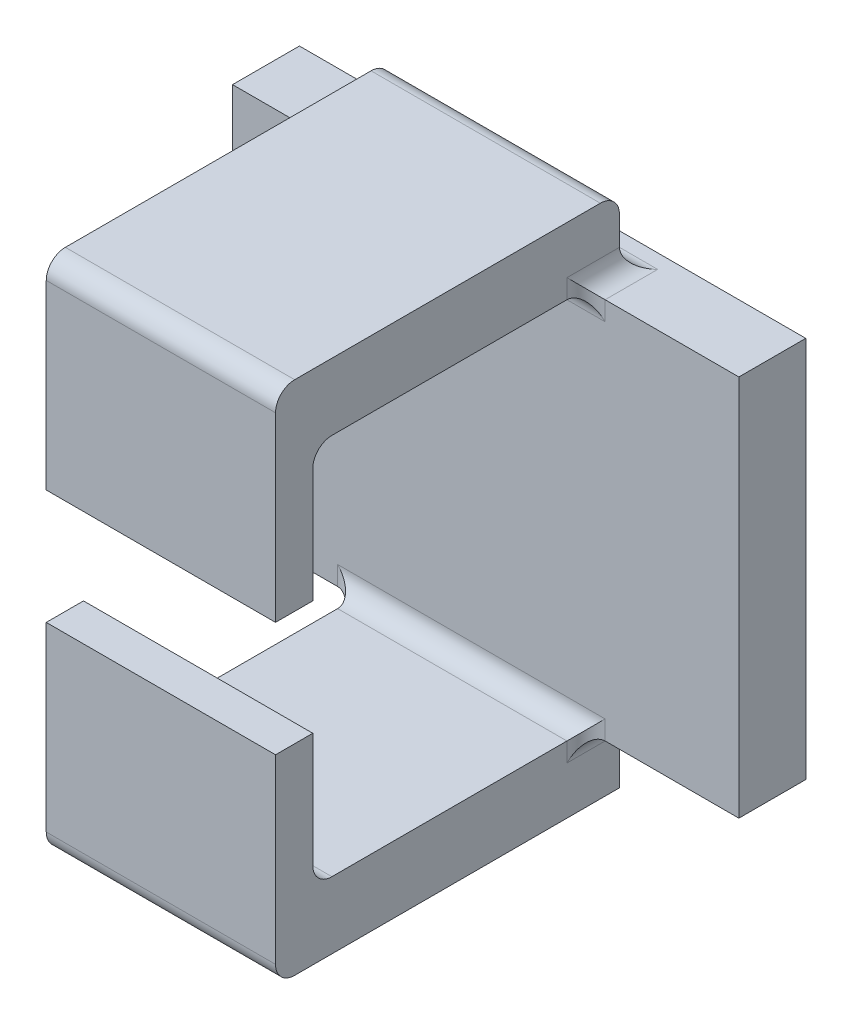
ISO-10303-21;
HEADER;
FILE_DESCRIPTION(('STEP AP214'),'2;1');
FILE_NAME('part.step','',(''),(''),'','','');
FILE_SCHEMA(('AUTOMOTIVE_DESIGN { 1 0 10303 214 1 1 1 1 }'));
ENDSEC;
DATA;
#1=APPLICATION_CONTEXT('core data for automotive mechanical design processes');
#2=APPLICATION_PROTOCOL_DEFINITION('international standard','automotive_design',2000,#1);
#3=PRODUCT_CONTEXT('',#1,'mechanical');
#4=PRODUCT('Part','Part','',(#3));
#5=PRODUCT_RELATED_PRODUCT_CATEGORY('part','',(#4));
#6=PRODUCT_DEFINITION_FORMATION('','',#4);
#7=PRODUCT_DEFINITION_CONTEXT('part definition',#1,'design');
#8=PRODUCT_DEFINITION('design','',#6,#7);
#9=PRODUCT_DEFINITION_SHAPE('','',#8);
#10=(LENGTH_UNIT() NAMED_UNIT(*) SI_UNIT(.MILLI.,.METRE.));
#11=(NAMED_UNIT(*) PLANE_ANGLE_UNIT() SI_UNIT($,.RADIAN.));
#12=(NAMED_UNIT(*) SI_UNIT($,.STERADIAN.) SOLID_ANGLE_UNIT());
#13=UNCERTAINTY_MEASURE_WITH_UNIT(LENGTH_MEASURE(1.E-05),#10,'distance_accuracy_value','');
#14=(GEOMETRIC_REPRESENTATION_CONTEXT(3) GLOBAL_UNCERTAINTY_ASSIGNED_CONTEXT((#13)) GLOBAL_UNIT_ASSIGNED_CONTEXT((#10,
#11,#12)) REPRESENTATION_CONTEXT('',''));
#15=CARTESIAN_POINT('',(0.,0.,0.));
#16=DIRECTION('',(0.,0.,1.));
#17=DIRECTION('',(1.,0.,0.));
#18=AXIS2_PLACEMENT_3D('',#15,#16,#17);
#19=CARTESIAN_POINT('',(0.,10.,0.));
#20=DIRECTION('',(0.,-1.,0.));
#21=DIRECTION('',(0.,0.,-1.));
#22=AXIS2_PLACEMENT_3D('',#19,#20,#21);
#23=PLANE('',#22);
#24=DIRECTION('',(0.,0.,-1.));
#25=VECTOR('',#24,1.);
#26=CARTESIAN_POINT('',(5.25,10.,1.75));
#27=LINE('',#26,#25);
#28=CARTESIAN_POINT('',(5.25000000000001,10.,16.8));
#29=VERTEX_POINT('',#28);
#30=CARTESIAN_POINT('',(5.25,10.,4.5));
#31=VERTEX_POINT('',#30);
#32=EDGE_CURVE('E303',#29,#31,#27,.T.);
#33=ORIENTED_EDGE('',*,*,#32,.F.);
#34=DIRECTION('',(1.,0.,0.));
#35=VECTOR('',#34,1.);
#36=CARTESIAN_POINT('',(0.,10.,16.8));
#37=LINE('',#36,#35);
#38=CARTESIAN_POINT('',(-6.75,10.,16.8));
#39=VERTEX_POINT('',#38);
#40=EDGE_CURVE('E453',#29,#39,#37,.F.);
#41=ORIENTED_EDGE('',*,*,#40,.T.);
#42=DIRECTION('',(0.,0.,1.));
#43=VECTOR('',#42,1.);
#44=CARTESIAN_POINT('',(-6.75,10.,1.75));
#45=LINE('',#44,#43);
#46=CARTESIAN_POINT('',(-6.75,10.,4.5));
#47=VERTEX_POINT('',#46);
#48=EDGE_CURVE('E308',#47,#39,#45,.T.);
#49=ORIENTED_EDGE('',*,*,#48,.F.);
#50=DIRECTION('',(-1.,0.,0.));
#51=VECTOR('',#50,1.);
#52=CARTESIAN_POINT('',(5.25000000000001,10.,4.5));
#53=LINE('',#52,#51);
#54=EDGE_CURVE('E361',#47,#31,#53,.F.);
#55=ORIENTED_EDGE('',*,*,#54,.T.);
#56=EDGE_LOOP('',(#33,#41,#49,#55));
#57=FACE_BOUND('',#56,.T.);
#58=ADVANCED_FACE('F33',(#57),#23,.T.);
#59=CARTESIAN_POINT('',(0.,-10.,0.));
#60=DIRECTION('',(0.,-1.,0.));
#61=DIRECTION('',(0.,0.,-1.));
#62=AXIS2_PLACEMENT_3D('',#59,#60,#61);
#63=PLANE('',#62);
#64=DIRECTION('',(0.,0.,-1.));
#65=VECTOR('',#64,1.);
#66=CARTESIAN_POINT('',(-6.75,-10.,1.75));
#67=LINE('',#66,#65);
#68=CARTESIAN_POINT('',(-6.75,-10.,16.8));
#69=VERTEX_POINT('',#68);
#70=CARTESIAN_POINT('',(-6.75,-10.,4.5));
#71=VERTEX_POINT('',#70);
#72=EDGE_CURVE('E287',#69,#71,#67,.T.);
#73=ORIENTED_EDGE('',*,*,#72,.F.);
#74=DIRECTION('',(-1.,0.,0.));
#75=VECTOR('',#74,1.);
#76=CARTESIAN_POINT('',(5.25,-10.,16.8));
#77=LINE('',#76,#75);
#78=CARTESIAN_POINT('',(5.25,-10.,16.8));
#79=VERTEX_POINT('',#78);
#80=EDGE_CURVE('E54',#69,#79,#77,.F.);
#81=ORIENTED_EDGE('',*,*,#80,.T.);
#82=DIRECTION('',(0.,0.,1.));
#83=VECTOR('',#82,1.);
#84=CARTESIAN_POINT('',(5.25,-10.,1.75));
#85=LINE('',#84,#83);
#86=CARTESIAN_POINT('',(5.25,-10.,4.5));
#87=VERTEX_POINT('',#86);
#88=EDGE_CURVE('E282',#87,#79,#85,.T.);
#89=ORIENTED_EDGE('',*,*,#88,.F.);
#90=DIRECTION('',(1.,0.,0.));
#91=VECTOR('',#90,1.);
#92=CARTESIAN_POINT('',(0.,-10.,4.5));
#93=LINE('',#92,#91);
#94=EDGE_CURVE('E371',#87,#71,#93,.F.);
#95=ORIENTED_EDGE('',*,*,#94,.T.);
#96=EDGE_LOOP('',(#73,#81,#89,#95));
#97=FACE_BOUND('',#96,.T.);
#98=ADVANCED_FACE('F516',(#97),#63,.F.);
#99=CARTESIAN_POINT('',(-13.25,-10.,3.5));
#100=DIRECTION('',(0.,1.,0.));
#101=DIRECTION('',(0.,0.,1.));
#102=AXIS2_PLACEMENT_3D('',#99,#100,#101);
#103=PLANE('',#102);
#104=DIRECTION('',(1.,0.,0.));
#105=VECTOR('',#104,1.);
#106=CARTESIAN_POINT('',(-13.25,-10.,3.5));
#107=LINE('',#106,#105);
#108=CARTESIAN_POINT('',(6.25,-10.,3.5));
#109=VERTEX_POINT('',#108);
#110=CARTESIAN_POINT('',(13.25,-10.,3.5));
#111=VERTEX_POINT('',#110);
#112=EDGE_CURVE('E331',#109,#111,#107,.T.);
#113=ORIENTED_EDGE('',*,*,#112,.F.);
#114=DIRECTION('',(0.,0.,1.));
#115=VECTOR('',#114,1.);
#116=CARTESIAN_POINT('',(6.25,-10.,0.75));
#117=LINE('',#116,#115);
#118=CARTESIAN_POINT('',(6.25,-10.,0.75));
#119=VERTEX_POINT('',#118);
#120=EDGE_CURVE('E435',#109,#119,#117,.F.);
#121=ORIENTED_EDGE('',*,*,#120,.T.);
#122=DIRECTION('',(1.,0.,0.));
#123=VECTOR('',#122,1.);
#124=CARTESIAN_POINT('',(-6.75,-10.,0.75));
#125=LINE('',#124,#123);
#126=CARTESIAN_POINT('',(-7.75,-10.,0.75));
#127=VERTEX_POINT('',#126);
#128=EDGE_CURVE('E367',#119,#127,#125,.F.);
#129=ORIENTED_EDGE('',*,*,#128,.T.);
#130=DIRECTION('',(0.,0.,-1.));
#131=VECTOR('',#130,1.);
#132=CARTESIAN_POINT('',(-7.75,-10.,3.5));
#133=LINE('',#132,#131);
#134=CARTESIAN_POINT('',(-7.75,-10.,3.5));
#135=VERTEX_POINT('',#134);
#136=EDGE_CURVE('E416',#127,#135,#133,.F.);
#137=ORIENTED_EDGE('',*,*,#136,.T.);
#138=CARTESIAN_POINT('',(-13.25,-10.,3.5));
#139=VERTEX_POINT('',#138);
#140=EDGE_CURVE('E332',#139,#135,#107,.T.);
#141=ORIENTED_EDGE('',*,*,#140,.F.);
#142=DIRECTION('',(0.,0.,-1.));
#143=VECTOR('',#142,1.);
#144=CARTESIAN_POINT('',(-13.25,-10.,3.5));
#145=LINE('',#144,#143);
#146=CARTESIAN_POINT('',(-13.25,-10.,0.));
#147=VERTEX_POINT('',#146);
#148=EDGE_CURVE('E345',#139,#147,#145,.T.);
#149=ORIENTED_EDGE('',*,*,#148,.T.);
#150=DIRECTION('',(1.,0.,0.));
#151=VECTOR('',#150,1.);
#152=CARTESIAN_POINT('',(-13.25,-10.,0.));
#153=LINE('',#152,#151);
#154=CARTESIAN_POINT('',(13.25,-10.,0.));
#155=VERTEX_POINT('',#154);
#156=EDGE_CURVE('E325',#147,#155,#153,.T.);
#157=ORIENTED_EDGE('',*,*,#156,.T.);
#158=DIRECTION('',(0.,0.,-1.));
#159=VECTOR('',#158,1.);
#160=CARTESIAN_POINT('',(13.25,-10.,3.5));
#161=LINE('',#160,#159);
#162=EDGE_CURVE('E335',#111,#155,#161,.T.);
#163=ORIENTED_EDGE('',*,*,#162,.F.);
#164=EDGE_LOOP('',(#113,#121,#129,#137,#141,#149,#157,#163));
#165=FACE_BOUND('',#164,.T.);
#166=ADVANCED_FACE('F522',(#165),#103,.F.);
#167=CARTESIAN_POINT('',(-13.25,10.,3.5));
#168=DIRECTION('',(0.,-1.,0.));
#169=DIRECTION('',(0.,0.,-1.));
#170=AXIS2_PLACEMENT_3D('',#167,#168,#169);
#171=PLANE('',#170);
#172=DIRECTION('',(-1.,0.,0.));
#173=VECTOR('',#172,1.);
#174=CARTESIAN_POINT('',(-13.25,10.,3.5));
#175=LINE('',#174,#173);
#176=CARTESIAN_POINT('',(-7.75,10.,3.5));
#177=VERTEX_POINT('',#176);
#178=CARTESIAN_POINT('',(-13.25,10.,3.5));
#179=VERTEX_POINT('',#178);
#180=EDGE_CURVE('E324',#177,#179,#175,.T.);
#181=ORIENTED_EDGE('',*,*,#180,.F.);
#182=DIRECTION('',(0.,0.,1.));
#183=VECTOR('',#182,1.);
#184=CARTESIAN_POINT('',(-7.75,10.,0.750000000000002));
#185=LINE('',#184,#183);
#186=CARTESIAN_POINT('',(-7.75,10.,0.750000000000002));
#187=VERTEX_POINT('',#186);
#188=EDGE_CURVE('E385',#177,#187,#185,.F.);
#189=ORIENTED_EDGE('',*,*,#188,.T.);
#190=DIRECTION('',(-1.,0.,0.));
#191=VECTOR('',#190,1.);
#192=CARTESIAN_POINT('',(5.25,10.,0.75));
#193=LINE('',#192,#191);
#194=CARTESIAN_POINT('',(6.25,10.,0.75));
#195=VERTEX_POINT('',#194);
#196=EDGE_CURVE('E357',#187,#195,#193,.F.);
#197=ORIENTED_EDGE('',*,*,#196,.T.);
#198=DIRECTION('',(0.,0.,-1.));
#199=VECTOR('',#198,1.);
#200=CARTESIAN_POINT('',(6.25,10.,3.5));
#201=LINE('',#200,#199);
#202=CARTESIAN_POINT('',(6.25,10.,3.5));
#203=VERTEX_POINT('',#202);
#204=EDGE_CURVE('E377',#195,#203,#201,.F.);
#205=ORIENTED_EDGE('',*,*,#204,.T.);
#206=CARTESIAN_POINT('',(13.25,10.,3.5));
#207=VERTEX_POINT('',#206);
#208=EDGE_CURVE('E326',#207,#203,#175,.T.);
#209=ORIENTED_EDGE('',*,*,#208,.F.);
#210=DIRECTION('',(0.,0.,-1.));
#211=VECTOR('',#210,1.);
#212=CARTESIAN_POINT('',(13.25,10.,3.5));
#213=LINE('',#212,#211);
#214=CARTESIAN_POINT('',(13.25,10.,0.));
#215=VERTEX_POINT('',#214);
#216=EDGE_CURVE('E351',#207,#215,#213,.T.);
#217=ORIENTED_EDGE('',*,*,#216,.T.);
#218=DIRECTION('',(-1.,0.,0.));
#219=VECTOR('',#218,1.);
#220=CARTESIAN_POINT('',(-13.25,10.,0.));
#221=LINE('',#220,#219);
#222=CARTESIAN_POINT('',(-13.25,10.,0.));
#223=VERTEX_POINT('',#222);
#224=EDGE_CURVE('E338',#215,#223,#221,.T.);
#225=ORIENTED_EDGE('',*,*,#224,.T.);
#226=DIRECTION('',(0.,0.,-1.));
#227=VECTOR('',#226,1.);
#228=CARTESIAN_POINT('',(-13.25,10.,3.5));
#229=LINE('',#228,#227);
#230=EDGE_CURVE('E348',#179,#223,#229,.T.);
#231=ORIENTED_EDGE('',*,*,#230,.F.);
#232=EDGE_LOOP('',(#181,#189,#197,#205,#209,#217,#225,#231));
#233=FACE_BOUND('',#232,.T.);
#234=ADVANCED_FACE('F554',(#233),#171,.F.);
#235=CARTESIAN_POINT('',(13.25,10.,3.5));
#236=DIRECTION('',(-1.,0.,0.));
#237=DIRECTION('',(0.,0.,1.));
#238=AXIS2_PLACEMENT_3D('',#235,#236,#237);
#239=PLANE('',#238);
#240=DIRECTION('',(0.,1.,0.));
#241=VECTOR('',#240,1.);
#242=CARTESIAN_POINT('',(13.25,10.,0.));
#243=LINE('',#242,#241);
#244=EDGE_CURVE('E320',#155,#215,#243,.T.);
#245=ORIENTED_EDGE('',*,*,#244,.T.);
#246=ORIENTED_EDGE('',*,*,#216,.F.);
#247=DIRECTION('',(0.,1.,0.));
#248=VECTOR('',#247,1.);
#249=CARTESIAN_POINT('',(13.25,10.,3.5));
#250=LINE('',#249,#248);
#251=EDGE_CURVE('E321',#111,#207,#250,.T.);
#252=ORIENTED_EDGE('',*,*,#251,.F.);
#253=ORIENTED_EDGE('',*,*,#162,.T.);
#254=EDGE_LOOP('',(#245,#246,#252,#253));
#255=FACE_BOUND('',#254,.T.);
#256=ADVANCED_FACE('F558',(#255),#239,.F.);
#257=CARTESIAN_POINT('',(-13.25,10.,3.5));
#258=DIRECTION('',(1.,0.,0.));
#259=DIRECTION('',(0.,1.,0.));
#260=AXIS2_PLACEMENT_3D('',#257,#258,#259);
#261=PLANE('',#260);
#262=DIRECTION('',(0.,-1.,0.));
#263=VECTOR('',#262,1.);
#264=CARTESIAN_POINT('',(-13.25,10.,0.));
#265=LINE('',#264,#263);
#266=EDGE_CURVE('E340',#223,#147,#265,.T.);
#267=ORIENTED_EDGE('',*,*,#266,.T.);
#268=ORIENTED_EDGE('',*,*,#148,.F.);
#269=DIRECTION('',(0.,-1.,0.));
#270=VECTOR('',#269,1.);
#271=CARTESIAN_POINT('',(-13.25,10.,3.5));
#272=LINE('',#271,#270);
#273=EDGE_CURVE('E329',#179,#139,#272,.T.);
#274=ORIENTED_EDGE('',*,*,#273,.F.);
#275=ORIENTED_EDGE('',*,*,#230,.T.);
#276=EDGE_LOOP('',(#267,#268,#274,#275));
#277=FACE_BOUND('',#276,.T.);
#278=ADVANCED_FACE('F547',(#277),#261,.F.);
#279=CARTESIAN_POINT('',(0.,0.,3.5));
#280=DIRECTION('',(0.,0.,1.));
#281=DIRECTION('',(1.,0.,0.));
#282=AXIS2_PLACEMENT_3D('',#279,#280,#281);
#283=PLANE('',#282);
#284=DIRECTION('',(1.,0.,0.));
#285=VECTOR('',#284,1.);
#286=CARTESIAN_POINT('',(0.,-9.,3.5));
#287=LINE('',#286,#285);
#288=CARTESIAN_POINT('',(-7.75,-9.,3.5));
#289=VERTEX_POINT('',#288);
#290=CARTESIAN_POINT('',(6.25,-9.,3.5));
#291=VERTEX_POINT('',#290);
#292=EDGE_CURVE('E369',#289,#291,#287,.T.);
#293=ORIENTED_EDGE('',*,*,#292,.T.);
#294=DIRECTION('',(0.,-1.,0.));
#295=VECTOR('',#294,1.);
#296=CARTESIAN_POINT('',(6.25,0.,3.5));
#297=LINE('',#296,#295);
#298=EDGE_CURVE('E440',#291,#109,#297,.T.);
#299=ORIENTED_EDGE('',*,*,#298,.T.);
#300=ORIENTED_EDGE('',*,*,#112,.T.);
#301=ORIENTED_EDGE('',*,*,#251,.T.);
#302=ORIENTED_EDGE('',*,*,#208,.T.);
#303=DIRECTION('',(0.,-1.,0.));
#304=VECTOR('',#303,1.);
#305=CARTESIAN_POINT('',(6.25,0.,3.5));
#306=LINE('',#305,#304);
#307=CARTESIAN_POINT('',(6.25,9.,3.5));
#308=VERTEX_POINT('',#307);
#309=EDGE_CURVE('E391',#203,#308,#306,.T.);
#310=ORIENTED_EDGE('',*,*,#309,.T.);
#311=DIRECTION('',(-1.,0.,0.));
#312=VECTOR('',#311,1.);
#313=CARTESIAN_POINT('',(-6.75,9.,3.5));
#314=LINE('',#313,#312);
#315=CARTESIAN_POINT('',(-7.75,9.,3.5));
#316=VERTEX_POINT('',#315);
#317=EDGE_CURVE('E359',#308,#316,#314,.T.);
#318=ORIENTED_EDGE('',*,*,#317,.T.);
#319=DIRECTION('',(0.,1.,0.));
#320=VECTOR('',#319,1.);
#321=CARTESIAN_POINT('',(-7.75,0.,3.5));
#322=LINE('',#321,#320);
#323=EDGE_CURVE('E402',#316,#177,#322,.T.);
#324=ORIENTED_EDGE('',*,*,#323,.T.);
#325=ORIENTED_EDGE('',*,*,#180,.T.);
#326=ORIENTED_EDGE('',*,*,#273,.T.);
#327=ORIENTED_EDGE('',*,*,#140,.T.);
#328=DIRECTION('',(0.,1.,0.));
#329=VECTOR('',#328,1.);
#330=CARTESIAN_POINT('',(-7.75,0.,3.5));
#331=LINE('',#330,#329);
#332=EDGE_CURVE('E422',#135,#289,#331,.T.);
#333=ORIENTED_EDGE('',*,*,#332,.T.);
#334=EDGE_LOOP('',(#293,#299,#300,#301,#302,#310,#318,#324,#325,#326,#327,#333));
#335=FACE_BOUND('',#334,.T.);
#336=ADVANCED_FACE('F544',(#335),#283,.T.);
#337=CARTESIAN_POINT('',(0.,0.,0.));
#338=DIRECTION('',(0.,0.,1.));
#339=DIRECTION('',(1.,0.,0.));
#340=AXIS2_PLACEMENT_3D('',#337,#338,#339);
#341=PLANE('',#340);
#342=ORIENTED_EDGE('',*,*,#244,.F.);
#343=ORIENTED_EDGE('',*,*,#156,.F.);
#344=ORIENTED_EDGE('',*,*,#266,.F.);
#345=ORIENTED_EDGE('',*,*,#224,.F.);
#346=EDGE_LOOP('',(#342,#343,#344,#345));
#347=FACE_BOUND('',#346,.T.);
#348=ADVANCED_FACE('F542',(#347),#341,.F.);
#349=CARTESIAN_POINT('',(5.25,13.5,1.75));
#350=DIRECTION('',(-1.,0.,0.));
#351=DIRECTION('',(0.,0.,1.));
#352=AXIS2_PLACEMENT_3D('',#349,#350,#351);
#353=PLANE('',#352);
#354=DIRECTION('',(0.,-1.,0.));
#355=VECTOR('',#354,1.);
#356=CARTESIAN_POINT('',(5.25,13.5,1.75));
#357=LINE('',#356,#355);
#358=CARTESIAN_POINT('',(5.25,12.5,1.75));
#359=VERTEX_POINT('',#358);
#360=CARTESIAN_POINT('',(5.25,11.,1.75));
#361=VERTEX_POINT('',#360);
#362=EDGE_CURVE('E318',#359,#361,#357,.T.);
#363=ORIENTED_EDGE('',*,*,#362,.F.);
#364=CARTESIAN_POINT('',(5.25,12.5,2.75));
#365=DIRECTION('',(-1.,0.,0.));
#366=DIRECTION('',(0.,0.,1.));
#367=AXIS2_PLACEMENT_3D('',#364,#365,#366);
#368=CIRCLE('',#367,1.);
#369=CARTESIAN_POINT('',(5.25,13.5,2.75));
#370=VERTEX_POINT('',#369);
#371=EDGE_CURVE('E475',#359,#370,#368,.F.);
#372=ORIENTED_EDGE('',*,*,#371,.T.);
#373=DIRECTION('',(0.,0.,-1.));
#374=VECTOR('',#373,1.);
#375=CARTESIAN_POINT('',(5.25,13.5,1.75));
#376=LINE('',#375,#374);
#377=CARTESIAN_POINT('',(5.25000000000001,13.5,18.75));
#378=VERTEX_POINT('',#377);
#379=EDGE_CURVE('E304',#378,#370,#376,.T.);
#380=ORIENTED_EDGE('',*,*,#379,.F.);
#381=CARTESIAN_POINT('',(5.25000000000001,12.5,18.75));
#382=DIRECTION('',(-1.,0.,0.));
#383=DIRECTION('',(0.,0.,1.));
#384=AXIS2_PLACEMENT_3D('',#381,#382,#383);
#385=CIRCLE('',#384,1.);
#386=CARTESIAN_POINT('',(5.25000000000001,12.5,19.75));
#387=VERTEX_POINT('',#386);
#388=EDGE_CURVE('E461',#378,#387,#385,.F.);
#389=ORIENTED_EDGE('',*,*,#388,.T.);
#390=DIRECTION('',(0.,-1.,0.));
#391=VECTOR('',#390,1.);
#392=CARTESIAN_POINT('',(5.25000000000001,13.5,19.75));
#393=LINE('',#392,#391);
#394=CARTESIAN_POINT('',(5.25000000000001,3.,19.75));
#395=VERTEX_POINT('',#394);
#396=EDGE_CURVE('E310',#387,#395,#393,.T.);
#397=ORIENTED_EDGE('',*,*,#396,.T.);
#398=DIRECTION('',(0.,0.,1.));
#399=VECTOR('',#398,1.);
#400=CARTESIAN_POINT('',(5.25000000000001,3.,19.75));
#401=LINE('',#400,#399);
#402=CARTESIAN_POINT('',(5.25000000000001,3.,17.8));
#403=VERTEX_POINT('',#402);
#404=EDGE_CURVE('E247',#403,#395,#401,.T.);
#405=ORIENTED_EDGE('',*,*,#404,.F.);
#406=DIRECTION('',(0.,1.,0.));
#407=VECTOR('',#406,1.);
#408=CARTESIAN_POINT('',(5.25000000000001,3.,17.8));
#409=LINE('',#408,#407);
#410=CARTESIAN_POINT('',(5.25000000000001,9.,17.8));
#411=VERTEX_POINT('',#410);
#412=EDGE_CURVE('E243',#403,#411,#409,.T.);
#413=ORIENTED_EDGE('',*,*,#412,.T.);
#414=CARTESIAN_POINT('',(5.25,9.,16.8));
#415=DIRECTION('',(-1.,0.,0.));
#416=DIRECTION('',(0.,0.,1.));
#417=AXIS2_PLACEMENT_3D('',#414,#415,#416);
#418=CIRCLE('',#417,1.);
#419=EDGE_CURVE('E455',#411,#29,#418,.T.);
#420=ORIENTED_EDGE('',*,*,#419,.T.);
#421=ORIENTED_EDGE('',*,*,#32,.T.);
#422=DIRECTION('',(0.,-1.,0.));
#423=VECTOR('',#422,1.);
#424=CARTESIAN_POINT('',(5.25,13.5,4.5));
#425=LINE('',#424,#423);
#426=CARTESIAN_POINT('',(5.25,11.,4.5));
#427=VERTEX_POINT('',#426);
#428=EDGE_CURVE('E394',#31,#427,#425,.F.);
#429=ORIENTED_EDGE('',*,*,#428,.T.);
#430=DIRECTION('',(0.,0.,-1.));
#431=VECTOR('',#430,1.);
#432=CARTESIAN_POINT('',(5.25,11.,0.75));
#433=LINE('',#432,#431);
#434=EDGE_CURVE('E374',#427,#361,#433,.T.);
#435=ORIENTED_EDGE('',*,*,#434,.T.);
#436=EDGE_LOOP('',(#363,#372,#380,#389,#397,#405,#413,#420,#421,#429,#435));
#437=FACE_BOUND('',#436,.T.);
#438=ADVANCED_FACE('F538',(#437),#353,.F.);
#439=CARTESIAN_POINT('',(5.25,13.5,1.75));
#440=DIRECTION('',(0.,0.,1.));
#441=DIRECTION('',(1.,0.,0.));
#442=AXIS2_PLACEMENT_3D('',#439,#440,#441);
#443=PLANE('',#442);
#444=DIRECTION('',(0.,-1.,0.));
#445=VECTOR('',#444,1.);
#446=CARTESIAN_POINT('',(-6.75,13.5,1.75));
#447=LINE('',#446,#445);
#448=CARTESIAN_POINT('',(-6.75,12.5,1.75));
#449=VERTEX_POINT('',#448);
#450=CARTESIAN_POINT('',(-6.75,11.,1.75));
#451=VERTEX_POINT('',#450);
#452=EDGE_CURVE('E316',#449,#451,#447,.T.);
#453=ORIENTED_EDGE('',*,*,#452,.F.);
#454=DIRECTION('',(-1.,0.,0.));
#455=VECTOR('',#454,1.);
#456=CARTESIAN_POINT('',(5.25,12.5,1.75));
#457=LINE('',#456,#455);
#458=EDGE_CURVE('E473',#449,#359,#457,.F.);
#459=ORIENTED_EDGE('',*,*,#458,.T.);
#460=ORIENTED_EDGE('',*,*,#362,.T.);
#461=DIRECTION('',(-1.,0.,0.));
#462=VECTOR('',#461,1.);
#463=CARTESIAN_POINT('',(-6.75,11.,1.75));
#464=LINE('',#463,#462);
#465=EDGE_CURVE('E354',#361,#451,#464,.T.);
#466=ORIENTED_EDGE('',*,*,#465,.T.);
#467=EDGE_LOOP('',(#453,#459,#460,#466));
#468=FACE_BOUND('',#467,.T.);
#469=ADVANCED_FACE('F535',(#468),#443,.F.);
#470=CARTESIAN_POINT('',(-6.75,13.5,1.75));
#471=DIRECTION('',(1.,0.,0.));
#472=DIRECTION('',(0.,0.,-1.));
#473=AXIS2_PLACEMENT_3D('',#470,#471,#472);
#474=PLANE('',#473);
#475=DIRECTION('',(0.,0.,1.));
#476=VECTOR('',#475,1.);
#477=CARTESIAN_POINT('',(-6.75,13.5,1.75));
#478=LINE('',#477,#476);
#479=CARTESIAN_POINT('',(-6.75,13.5,2.75));
#480=VERTEX_POINT('',#479);
#481=CARTESIAN_POINT('',(-6.75,13.5,18.75));
#482=VERTEX_POINT('',#481);
#483=EDGE_CURVE('E307',#480,#482,#478,.T.);
#484=ORIENTED_EDGE('',*,*,#483,.F.);
#485=CARTESIAN_POINT('',(-6.75,12.5,2.75));
#486=DIRECTION('',(1.,0.,0.));
#487=DIRECTION('',(0.,0.,-1.));
#488=AXIS2_PLACEMENT_3D('',#485,#486,#487);
#489=CIRCLE('',#488,1.);
#490=EDGE_CURVE('E471',#480,#449,#489,.F.);
#491=ORIENTED_EDGE('',*,*,#490,.T.);
#492=ORIENTED_EDGE('',*,*,#452,.T.);
#493=DIRECTION('',(0.,0.,1.));
#494=VECTOR('',#493,1.);
#495=CARTESIAN_POINT('',(-6.75,11.,3.5));
#496=LINE('',#495,#494);
#497=CARTESIAN_POINT('',(-6.75,11.,4.5));
#498=VERTEX_POINT('',#497);
#499=EDGE_CURVE('E383',#451,#498,#496,.T.);
#500=ORIENTED_EDGE('',*,*,#499,.T.);
#501=DIRECTION('',(0.,1.,0.));
#502=VECTOR('',#501,1.);
#503=CARTESIAN_POINT('',(-6.75,13.5,4.5));
#504=LINE('',#503,#502);
#505=EDGE_CURVE('E405',#498,#47,#504,.F.);
#506=ORIENTED_EDGE('',*,*,#505,.T.);
#507=ORIENTED_EDGE('',*,*,#48,.T.);
#508=CARTESIAN_POINT('',(-6.75,9.,16.8));
#509=DIRECTION('',(1.,0.,0.));
#510=DIRECTION('',(0.,0.,-1.));
#511=AXIS2_PLACEMENT_3D('',#508,#509,#510);
#512=CIRCLE('',#511,1.);
#513=CARTESIAN_POINT('',(-6.75,9.,17.8));
#514=VERTEX_POINT('',#513);
#515=EDGE_CURVE('E262',#39,#514,#512,.T.);
#516=ORIENTED_EDGE('',*,*,#515,.T.);
#517=DIRECTION('',(0.,1.,0.));
#518=VECTOR('',#517,1.);
#519=CARTESIAN_POINT('',(-6.75,3.,17.8));
#520=LINE('',#519,#518);
#521=CARTESIAN_POINT('',(-6.75,3.,17.8));
#522=VERTEX_POINT('',#521);
#523=EDGE_CURVE('E240',#522,#514,#520,.T.);
#524=ORIENTED_EDGE('',*,*,#523,.F.);
#525=DIRECTION('',(0.,0.,-1.));
#526=VECTOR('',#525,1.);
#527=CARTESIAN_POINT('',(-6.75,3.,19.75));
#528=LINE('',#527,#526);
#529=CARTESIAN_POINT('',(-6.75,3.,19.75));
#530=VERTEX_POINT('',#529);
#531=EDGE_CURVE('E248',#530,#522,#528,.T.);
#532=ORIENTED_EDGE('',*,*,#531,.F.);
#533=DIRECTION('',(0.,-1.,0.));
#534=VECTOR('',#533,1.);
#535=CARTESIAN_POINT('',(-6.75,13.5,19.75));
#536=LINE('',#535,#534);
#537=CARTESIAN_POINT('',(-6.75,12.5,19.75));
#538=VERTEX_POINT('',#537);
#539=EDGE_CURVE('E314',#538,#530,#536,.T.);
#540=ORIENTED_EDGE('',*,*,#539,.F.);
#541=CARTESIAN_POINT('',(-6.75,12.5,18.75));
#542=DIRECTION('',(1.,0.,0.));
#543=DIRECTION('',(0.,0.,-1.));
#544=AXIS2_PLACEMENT_3D('',#541,#542,#543);
#545=CIRCLE('',#544,1.);
#546=EDGE_CURVE('E465',#538,#482,#545,.F.);
#547=ORIENTED_EDGE('',*,*,#546,.T.);
#548=EDGE_LOOP('',(#484,#491,#492,#500,#506,#507,#516,#524,#532,#540,#547));
#549=FACE_BOUND('',#548,.T.);
#550=ADVANCED_FACE('F259',(#549),#474,.F.);
#551=CARTESIAN_POINT('',(5.25000000000001,13.5,19.75));
#552=DIRECTION('',(0.,0.,-1.));
#553=DIRECTION('',(-1.,0.,0.));
#554=AXIS2_PLACEMENT_3D('',#551,#552,#553);
#555=PLANE('',#554);
#556=ORIENTED_EDGE('',*,*,#396,.F.);
#557=DIRECTION('',(1.,0.,0.));
#558=VECTOR('',#557,1.);
#559=CARTESIAN_POINT('',(5.25000000000001,12.5,19.75));
#560=LINE('',#559,#558);
#561=EDGE_CURVE('E463',#387,#538,#560,.F.);
#562=ORIENTED_EDGE('',*,*,#561,.T.);
#563=ORIENTED_EDGE('',*,*,#539,.T.);
#564=DIRECTION('',(-1.,0.,0.));
#565=VECTOR('',#564,1.);
#566=CARTESIAN_POINT('',(-6.75,3.,19.75));
#567=LINE('',#566,#565);
#568=EDGE_CURVE('E254',#395,#530,#567,.T.);
#569=ORIENTED_EDGE('',*,*,#568,.F.);
#570=EDGE_LOOP('',(#556,#562,#563,#569));
#571=FACE_BOUND('',#570,.T.);
#572=ADVANCED_FACE('F529',(#571),#555,.F.);
#573=CARTESIAN_POINT('',(0.,13.5,0.));
#574=DIRECTION('',(0.,-1.,0.));
#575=DIRECTION('',(0.,0.,-1.));
#576=AXIS2_PLACEMENT_3D('',#573,#574,#575);
#577=PLANE('',#576);
#578=ORIENTED_EDGE('',*,*,#379,.T.);
#579=DIRECTION('',(-1.,0.,0.));
#580=VECTOR('',#579,1.);
#581=CARTESIAN_POINT('',(0.,13.5,2.75));
#582=LINE('',#581,#580);
#583=EDGE_CURVE('E468',#370,#480,#582,.T.);
#584=ORIENTED_EDGE('',*,*,#583,.T.);
#585=ORIENTED_EDGE('',*,*,#483,.T.);
#586=DIRECTION('',(1.,0.,0.));
#587=VECTOR('',#586,1.);
#588=CARTESIAN_POINT('',(0.,13.5,18.75));
#589=LINE('',#588,#587);
#590=EDGE_CURVE('E458',#482,#378,#589,.T.);
#591=ORIENTED_EDGE('',*,*,#590,.T.);
#592=EDGE_LOOP('',(#578,#584,#585,#591));
#593=FACE_BOUND('',#592,.T.);
#594=ADVANCED_FACE('F527',(#593),#577,.F.);
#595=CARTESIAN_POINT('',(5.25,11.,0.75));
#596=DIRECTION('',(1.,0.,0.));
#597=DIRECTION('',(0.,0.,-1.));
#598=AXIS2_PLACEMENT_3D('',#595,#596,#597);
#599=CYLINDRICAL_SURFACE('',#598,1.);
#600=ORIENTED_EDGE('',*,*,#465,.F.);
#601=CARTESIAN_POINT('',(6.25,11.,0.75));
#602=DIRECTION('',(0.707106781186548,0.,0.707106781186547));
#603=DIRECTION('',(0.707106781186547,0.,-0.707106781186548));
#604=AXIS2_PLACEMENT_3D('',#601,#602,#603);
#605=ELLIPSE('',#604,1.41421356237309,1.);
#606=EDGE_CURVE('E380',#361,#195,#605,.T.);
#607=ORIENTED_EDGE('',*,*,#606,.T.);
#608=ORIENTED_EDGE('',*,*,#196,.F.);
#609=CARTESIAN_POINT('',(-7.75,11.,0.750000000000002));
#610=DIRECTION('',(0.707106781186547,0.,-0.707106781186548));
#611=DIRECTION('',(0.707106781186548,0.,0.707106781186547));
#612=AXIS2_PLACEMENT_3D('',#609,#610,#611);
#613=ELLIPSE('',#612,1.41421356237309,1.);
#614=EDGE_CURVE('E388',#187,#451,#613,.F.);
#615=ORIENTED_EDGE('',*,*,#614,.T.);
#616=EDGE_LOOP('',(#600,#607,#608,#615));
#617=FACE_BOUND('',#616,.T.);
#618=ADVANCED_FACE('F566',(#617),#599,.F.);
#619=CARTESIAN_POINT('',(0.,9.,4.5));
#620=DIRECTION('',(1.,0.,0.));
#621=DIRECTION('',(0.,0.,-1.));
#622=AXIS2_PLACEMENT_3D('',#619,#620,#621);
#623=CYLINDRICAL_SURFACE('',#622,1.);
#624=ORIENTED_EDGE('',*,*,#317,.F.);
#625=CARTESIAN_POINT('',(6.25,9.,4.5));
#626=DIRECTION('',(0.707106781186547,0.707106781186547,0.));
#627=DIRECTION('',(0.707106781186547,-0.707106781186547,0.));
#628=AXIS2_PLACEMENT_3D('',#625,#626,#627);
#629=ELLIPSE('',#628,1.41421356237309,1.);
#630=EDGE_CURVE('E397',#308,#31,#629,.T.);
#631=ORIENTED_EDGE('',*,*,#630,.T.);
#632=ORIENTED_EDGE('',*,*,#54,.F.);
#633=CARTESIAN_POINT('',(-7.75,9.,4.5));
#634=DIRECTION('',(0.707106781186547,-0.707106781186547,0.));
#635=DIRECTION('',(0.707106781186547,0.707106781186547,0.));
#636=AXIS2_PLACEMENT_3D('',#633,#634,#635);
#637=ELLIPSE('',#636,1.41421356237309,1.);
#638=EDGE_CURVE('E410',#47,#316,#637,.F.);
#639=ORIENTED_EDGE('',*,*,#638,.T.);
#640=EDGE_LOOP('',(#624,#631,#632,#639));
#641=FACE_BOUND('',#640,.T.);
#642=ADVANCED_FACE('F569',(#641),#623,.F.);
#643=CARTESIAN_POINT('',(5.25,-13.5,1.75));
#644=DIRECTION('',(-1.,0.,0.));
#645=DIRECTION('',(0.,0.,1.));
#646=AXIS2_PLACEMENT_3D('',#643,#644,#645);
#647=PLANE('',#646);
#648=DIRECTION('',(0.,1.,0.));
#649=VECTOR('',#648,1.);
#650=CARTESIAN_POINT('',(5.25,-13.5,19.75));
#651=LINE('',#650,#649);
#652=CARTESIAN_POINT('',(5.25,-12.5,19.75));
#653=VERTEX_POINT('',#652);
#654=CARTESIAN_POINT('',(5.25,-3.,19.75));
#655=VERTEX_POINT('',#654);
#656=EDGE_CURVE('E301',#653,#655,#651,.T.);
#657=ORIENTED_EDGE('',*,*,#656,.F.);
#658=CARTESIAN_POINT('',(5.25,-12.5,18.75));
#659=DIRECTION('',(-1.,0.,0.));
#660=DIRECTION('',(0.,0.,1.));
#661=AXIS2_PLACEMENT_3D('',#658,#659,#660);
#662=CIRCLE('',#661,1.);
#663=CARTESIAN_POINT('',(5.25,-13.5,18.75));
#664=VERTEX_POINT('',#663);
#665=EDGE_CURVE('E484',#653,#664,#662,.F.);
#666=ORIENTED_EDGE('',*,*,#665,.T.);
#667=DIRECTION('',(0.,0.,1.));
#668=VECTOR('',#667,1.);
#669=CARTESIAN_POINT('',(5.25,-13.5,1.75));
#670=LINE('',#669,#668);
#671=CARTESIAN_POINT('',(5.25,-13.5,1.75));
#672=VERTEX_POINT('',#671);
#673=EDGE_CURVE('E283',#672,#664,#670,.T.);
#674=ORIENTED_EDGE('',*,*,#673,.F.);
#675=DIRECTION('',(0.,1.,0.));
#676=VECTOR('',#675,1.);
#677=CARTESIAN_POINT('',(5.25,-13.5,1.75));
#678=LINE('',#677,#676);
#679=CARTESIAN_POINT('',(5.25,-11.,1.75));
#680=VERTEX_POINT('',#679);
#681=EDGE_CURVE('E291',#672,#680,#678,.T.);
#682=ORIENTED_EDGE('',*,*,#681,.T.);
#683=DIRECTION('',(0.,0.,1.));
#684=VECTOR('',#683,1.);
#685=CARTESIAN_POINT('',(5.25,-11.,3.5));
#686=LINE('',#685,#684);
#687=CARTESIAN_POINT('',(5.25,-11.,4.5));
#688=VERTEX_POINT('',#687);
#689=EDGE_CURVE('E433',#680,#688,#686,.T.);
#690=ORIENTED_EDGE('',*,*,#689,.T.);
#691=DIRECTION('',(0.,-1.,0.));
#692=VECTOR('',#691,1.);
#693=CARTESIAN_POINT('',(5.25,-13.5,4.5));
#694=LINE('',#693,#692);
#695=EDGE_CURVE('E443',#688,#87,#694,.F.);
#696=ORIENTED_EDGE('',*,*,#695,.T.);
#697=ORIENTED_EDGE('',*,*,#88,.T.);
#698=CARTESIAN_POINT('',(5.25,-9.,16.8));
#699=DIRECTION('',(-1.,0.,0.));
#700=DIRECTION('',(0.,0.,1.));
#701=AXIS2_PLACEMENT_3D('',#698,#699,#700);
#702=CIRCLE('',#701,1.);
#703=CARTESIAN_POINT('',(5.25,-9.,17.8));
#704=VERTEX_POINT('',#703);
#705=EDGE_CURVE('E11',#79,#704,#702,.T.);
#706=ORIENTED_EDGE('',*,*,#705,.T.);
#707=DIRECTION('',(0.,-1.,0.));
#708=VECTOR('',#707,1.);
#709=CARTESIAN_POINT('',(5.25,-3.,17.8));
#710=LINE('',#709,#708);
#711=CARTESIAN_POINT('',(5.25,-3.,17.8));
#712=VERTEX_POINT('',#711);
#713=EDGE_CURVE('E279',#712,#704,#710,.T.);
#714=ORIENTED_EDGE('',*,*,#713,.F.);
#715=DIRECTION('',(0.,0.,-1.));
#716=VECTOR('',#715,1.);
#717=CARTESIAN_POINT('',(5.25,-3.,19.75));
#718=LINE('',#717,#716);
#719=EDGE_CURVE('E273',#655,#712,#718,.T.);
#720=ORIENTED_EDGE('',*,*,#719,.F.);
#721=EDGE_LOOP('',(#657,#666,#674,#682,#690,#696,#697,#706,#714,#720));
#722=FACE_BOUND('',#721,.T.);
#723=ADVANCED_FACE('F507',(#722),#647,.F.);
#724=CARTESIAN_POINT('',(5.25,-13.5,19.75));
#725=DIRECTION('',(0.,0.,-1.));
#726=DIRECTION('',(-1.,0.,0.));
#727=AXIS2_PLACEMENT_3D('',#724,#725,#726);
#728=PLANE('',#727);
#729=DIRECTION('',(0.,1.,0.));
#730=VECTOR('',#729,1.);
#731=CARTESIAN_POINT('',(-6.75,-13.5,19.75));
#732=LINE('',#731,#730);
#733=CARTESIAN_POINT('',(-6.75,-12.5,19.75));
#734=VERTEX_POINT('',#733);
#735=CARTESIAN_POINT('',(-6.75,-3.,19.75));
#736=VERTEX_POINT('',#735);
#737=EDGE_CURVE('E299',#734,#736,#732,.T.);
#738=ORIENTED_EDGE('',*,*,#737,.F.);
#739=DIRECTION('',(-1.,0.,0.));
#740=VECTOR('',#739,1.);
#741=CARTESIAN_POINT('',(5.25,-12.5,19.75));
#742=LINE('',#741,#740);
#743=EDGE_CURVE('E482',#734,#653,#742,.F.);
#744=ORIENTED_EDGE('',*,*,#743,.T.);
#745=ORIENTED_EDGE('',*,*,#656,.T.);
#746=DIRECTION('',(1.,0.,0.));
#747=VECTOR('',#746,1.);
#748=CARTESIAN_POINT('',(-6.75,-3.,19.75));
#749=LINE('',#748,#747);
#750=EDGE_CURVE('E266',#736,#655,#749,.T.);
#751=ORIENTED_EDGE('',*,*,#750,.F.);
#752=EDGE_LOOP('',(#738,#744,#745,#751));
#753=FACE_BOUND('',#752,.T.);
#754=ADVANCED_FACE('F691',(#753),#728,.F.);
#755=CARTESIAN_POINT('',(-6.75,-13.5,1.75));
#756=DIRECTION('',(1.,0.,0.));
#757=DIRECTION('',(0.,0.,-1.));
#758=AXIS2_PLACEMENT_3D('',#755,#756,#757);
#759=PLANE('',#758);
#760=DIRECTION('',(0.,0.,-1.));
#761=VECTOR('',#760,1.);
#762=CARTESIAN_POINT('',(-6.75,-13.5,1.75));
#763=LINE('',#762,#761);
#764=CARTESIAN_POINT('',(-6.75,-13.5,18.75));
#765=VERTEX_POINT('',#764);
#766=CARTESIAN_POINT('',(-6.75,-13.5,1.75));
#767=VERTEX_POINT('',#766);
#768=EDGE_CURVE('E286',#765,#767,#763,.T.);
#769=ORIENTED_EDGE('',*,*,#768,.F.);
#770=CARTESIAN_POINT('',(-6.75,-12.5,18.75));
#771=DIRECTION('',(1.,0.,0.));
#772=DIRECTION('',(0.,0.,-1.));
#773=AXIS2_PLACEMENT_3D('',#770,#771,#772);
#774=CIRCLE('',#773,1.);
#775=EDGE_CURVE('E480',#765,#734,#774,.F.);
#776=ORIENTED_EDGE('',*,*,#775,.T.);
#777=ORIENTED_EDGE('',*,*,#737,.T.);
#778=DIRECTION('',(0.,0.,1.));
#779=VECTOR('',#778,1.);
#780=CARTESIAN_POINT('',(-6.75,-3.,19.75));
#781=LINE('',#780,#779);
#782=CARTESIAN_POINT('',(-6.75,-3.,17.8));
#783=VERTEX_POINT('',#782);
#784=EDGE_CURVE('E263',#783,#736,#781,.T.);
#785=ORIENTED_EDGE('',*,*,#784,.F.);
#786=DIRECTION('',(0.,-1.,0.));
#787=VECTOR('',#786,1.);
#788=CARTESIAN_POINT('',(-6.75,-3.,17.8));
#789=LINE('',#788,#787);
#790=CARTESIAN_POINT('',(-6.75,-9.,17.8));
#791=VERTEX_POINT('',#790);
#792=EDGE_CURVE('E277',#783,#791,#789,.T.);
#793=ORIENTED_EDGE('',*,*,#792,.T.);
#794=CARTESIAN_POINT('',(-6.75,-9.,16.8));
#795=DIRECTION('',(1.,0.,0.));
#796=DIRECTION('',(0.,0.,-1.));
#797=AXIS2_PLACEMENT_3D('',#794,#795,#796);
#798=CIRCLE('',#797,1.);
#799=EDGE_CURVE('E41',#791,#69,#798,.T.);
#800=ORIENTED_EDGE('',*,*,#799,.T.);
#801=ORIENTED_EDGE('',*,*,#72,.T.);
#802=DIRECTION('',(0.,1.,0.));
#803=VECTOR('',#802,1.);
#804=CARTESIAN_POINT('',(-6.75,-13.5,4.5));
#805=LINE('',#804,#803);
#806=CARTESIAN_POINT('',(-6.75,-11.,4.5));
#807=VERTEX_POINT('',#806);
#808=EDGE_CURVE('E425',#71,#807,#805,.F.);
#809=ORIENTED_EDGE('',*,*,#808,.T.);
#810=DIRECTION('',(0.,0.,-1.));
#811=VECTOR('',#810,1.);
#812=CARTESIAN_POINT('',(-6.75,-11.,0.75));
#813=LINE('',#812,#811);
#814=CARTESIAN_POINT('',(-6.75,-11.,1.75));
#815=VERTEX_POINT('',#814);
#816=EDGE_CURVE('E413',#807,#815,#813,.T.);
#817=ORIENTED_EDGE('',*,*,#816,.T.);
#818=DIRECTION('',(0.,1.,0.));
#819=VECTOR('',#818,1.);
#820=CARTESIAN_POINT('',(-6.75,-13.5,1.75));
#821=LINE('',#820,#819);
#822=EDGE_CURVE('E296',#767,#815,#821,.T.);
#823=ORIENTED_EDGE('',*,*,#822,.F.);
#824=EDGE_LOOP('',(#769,#776,#777,#785,#793,#800,#801,#809,#817,#823));
#825=FACE_BOUND('',#824,.T.);
#826=ADVANCED_FACE('F499',(#825),#759,.F.);
#827=CARTESIAN_POINT('',(5.25,-13.5,1.75));
#828=DIRECTION('',(0.,0.,1.));
#829=DIRECTION('',(1.,0.,0.));
#830=AXIS2_PLACEMENT_3D('',#827,#828,#829);
#831=PLANE('',#830);
#832=ORIENTED_EDGE('',*,*,#822,.T.);
#833=DIRECTION('',(1.,0.,0.));
#834=VECTOR('',#833,1.);
#835=CARTESIAN_POINT('',(5.25,-11.,1.75));
#836=LINE('',#835,#834);
#837=EDGE_CURVE('E364',#815,#680,#836,.T.);
#838=ORIENTED_EDGE('',*,*,#837,.T.);
#839=ORIENTED_EDGE('',*,*,#681,.F.);
#840=DIRECTION('',(1.,0.,0.));
#841=VECTOR('',#840,1.);
#842=CARTESIAN_POINT('',(5.25,-13.5,1.75));
#843=LINE('',#842,#841);
#844=EDGE_CURVE('E289',#767,#672,#843,.T.);
#845=ORIENTED_EDGE('',*,*,#844,.F.);
#846=EDGE_LOOP('',(#832,#838,#839,#845));
#847=FACE_BOUND('',#846,.T.);
#848=ADVANCED_FACE('F682',(#847),#831,.F.);
#849=CARTESIAN_POINT('',(0.,-13.5,0.));
#850=DIRECTION('',(0.,-1.,0.));
#851=DIRECTION('',(0.,0.,-1.));
#852=AXIS2_PLACEMENT_3D('',#849,#850,#851);
#853=PLANE('',#852);
#854=ORIENTED_EDGE('',*,*,#673,.T.);
#855=DIRECTION('',(-1.,0.,0.));
#856=VECTOR('',#855,1.);
#857=CARTESIAN_POINT('',(-6.75,-13.5,18.75));
#858=LINE('',#857,#856);
#859=EDGE_CURVE('E477',#664,#765,#858,.T.);
#860=ORIENTED_EDGE('',*,*,#859,.T.);
#861=ORIENTED_EDGE('',*,*,#768,.T.);
#862=ORIENTED_EDGE('',*,*,#844,.T.);
#863=EDGE_LOOP('',(#854,#860,#861,#862));
#864=FACE_BOUND('',#863,.T.);
#865=ADVANCED_FACE('F578',(#864),#853,.T.);
#866=CARTESIAN_POINT('',(5.25,-11.,0.75));
#867=DIRECTION('',(-1.,0.,0.));
#868=DIRECTION('',(0.,0.,1.));
#869=AXIS2_PLACEMENT_3D('',#866,#867,#868);
#870=CYLINDRICAL_SURFACE('',#869,1.);
#871=ORIENTED_EDGE('',*,*,#837,.F.);
#872=CARTESIAN_POINT('',(-7.75,-11.,0.75));
#873=DIRECTION('',(-0.707106781186547,0.,0.707106781186547));
#874=DIRECTION('',(-0.707106781186547,0.,-0.707106781186547));
#875=AXIS2_PLACEMENT_3D('',#872,#873,#874);
#876=ELLIPSE('',#875,1.41421356237309,1.);
#877=EDGE_CURVE('E419',#815,#127,#876,.T.);
#878=ORIENTED_EDGE('',*,*,#877,.T.);
#879=ORIENTED_EDGE('',*,*,#128,.F.);
#880=CARTESIAN_POINT('',(6.25,-11.,0.75));
#881=DIRECTION('',(-0.707106781186547,0.,-0.707106781186548));
#882=DIRECTION('',(-0.707106781186548,0.,0.707106781186547));
#883=AXIS2_PLACEMENT_3D('',#880,#881,#882);
#884=ELLIPSE('',#883,1.4142135623731,1.);
#885=EDGE_CURVE('E438',#119,#680,#884,.F.);
#886=ORIENTED_EDGE('',*,*,#885,.T.);
#887=EDGE_LOOP('',(#871,#878,#879,#886));
#888=FACE_BOUND('',#887,.T.);
#889=ADVANCED_FACE('F574',(#888),#870,.F.);
#890=CARTESIAN_POINT('',(0.,-9.,4.5));
#891=DIRECTION('',(1.,0.,0.));
#892=DIRECTION('',(0.,0.,-1.));
#893=AXIS2_PLACEMENT_3D('',#890,#891,#892);
#894=CYLINDRICAL_SURFACE('',#893,1.);
#895=ORIENTED_EDGE('',*,*,#292,.F.);
#896=CARTESIAN_POINT('',(-7.75,-9.,4.5));
#897=DIRECTION('',(0.707106781186547,0.707106781186547,0.));
#898=DIRECTION('',(0.707106781186547,-0.707106781186547,0.));
#899=AXIS2_PLACEMENT_3D('',#896,#897,#898);
#900=ELLIPSE('',#899,1.41421356237309,1.);
#901=EDGE_CURVE('E428',#289,#71,#900,.F.);
#902=ORIENTED_EDGE('',*,*,#901,.T.);
#903=ORIENTED_EDGE('',*,*,#94,.F.);
#904=CARTESIAN_POINT('',(6.25,-9.,4.5));
#905=DIRECTION('',(0.707106781186547,-0.707106781186547,0.));
#906=DIRECTION('',(0.707106781186547,0.707106781186547,0.));
#907=AXIS2_PLACEMENT_3D('',#904,#905,#906);
#908=ELLIPSE('',#907,1.41421356237309,1.);
#909=EDGE_CURVE('E448',#87,#291,#908,.T.);
#910=ORIENTED_EDGE('',*,*,#909,.T.);
#911=EDGE_LOOP('',(#895,#902,#903,#910));
#912=FACE_BOUND('',#911,.T.);
#913=ADVANCED_FACE('F577',(#912),#894,.F.);
#914=CARTESIAN_POINT('',(6.25,11.,1.75));
#915=DIRECTION('',(0.,0.,1.));
#916=DIRECTION('',(1.,0.,0.));
#917=AXIS2_PLACEMENT_3D('',#914,#915,#916);
#918=CYLINDRICAL_SURFACE('',#917,1.);
#919=ORIENTED_EDGE('',*,*,#434,.F.);
#920=CARTESIAN_POINT('',(6.25,11.,4.5));
#921=DIRECTION('',(0.,-0.707106781186547,0.707106781186547));
#922=DIRECTION('',(0.,0.707106781186547,0.707106781186547));
#923=AXIS2_PLACEMENT_3D('',#920,#921,#922);
#924=ELLIPSE('',#923,1.41421356237309,1.);
#925=EDGE_CURVE('E400',#427,#203,#924,.T.);
#926=ORIENTED_EDGE('',*,*,#925,.T.);
#927=ORIENTED_EDGE('',*,*,#204,.F.);
#928=ORIENTED_EDGE('',*,*,#606,.F.);
#929=EDGE_LOOP('',(#919,#926,#927,#928));
#930=FACE_BOUND('',#929,.T.);
#931=ADVANCED_FACE('F582',(#930),#918,.F.);
#932=CARTESIAN_POINT('',(-7.75,11.,1.75));
#933=DIRECTION('',(0.,0.,-1.));
#934=DIRECTION('',(-1.,0.,0.));
#935=AXIS2_PLACEMENT_3D('',#932,#933,#934);
#936=CYLINDRICAL_SURFACE('',#935,1.);
#937=ORIENTED_EDGE('',*,*,#614,.F.);
#938=ORIENTED_EDGE('',*,*,#188,.F.);
#939=CARTESIAN_POINT('',(-7.75,11.,4.5));
#940=DIRECTION('',(0.,0.707106781186547,-0.707106781186547));
#941=DIRECTION('',(0.,-0.707106781186547,-0.707106781186547));
#942=AXIS2_PLACEMENT_3D('',#939,#940,#941);
#943=ELLIPSE('',#942,1.41421356237309,1.);
#944=EDGE_CURVE('E407',#177,#498,#943,.F.);
#945=ORIENTED_EDGE('',*,*,#944,.T.);
#946=ORIENTED_EDGE('',*,*,#499,.F.);
#947=EDGE_LOOP('',(#937,#938,#945,#946));
#948=FACE_BOUND('',#947,.T.);
#949=ADVANCED_FACE('F586',(#948),#936,.F.);
#950=CARTESIAN_POINT('',(6.25,0.,4.5));
#951=DIRECTION('',(0.,-1.,0.));
#952=DIRECTION('',(0.,0.,-1.));
#953=AXIS2_PLACEMENT_3D('',#950,#951,#952);
#954=CYLINDRICAL_SURFACE('',#953,1.);
#955=ORIENTED_EDGE('',*,*,#925,.F.);
#956=ORIENTED_EDGE('',*,*,#428,.F.);
#957=ORIENTED_EDGE('',*,*,#630,.F.);
#958=ORIENTED_EDGE('',*,*,#309,.F.);
#959=EDGE_LOOP('',(#955,#956,#957,#958));
#960=FACE_BOUND('',#959,.T.);
#961=ADVANCED_FACE('F590',(#960),#954,.F.);
#962=CARTESIAN_POINT('',(-7.75,0.,4.5));
#963=DIRECTION('',(0.,1.,0.));
#964=DIRECTION('',(0.,0.,1.));
#965=AXIS2_PLACEMENT_3D('',#962,#963,#964);
#966=CYLINDRICAL_SURFACE('',#965,1.);
#967=ORIENTED_EDGE('',*,*,#638,.F.);
#968=ORIENTED_EDGE('',*,*,#505,.F.);
#969=ORIENTED_EDGE('',*,*,#944,.F.);
#970=ORIENTED_EDGE('',*,*,#323,.F.);
#971=EDGE_LOOP('',(#967,#968,#969,#970));
#972=FACE_BOUND('',#971,.T.);
#973=ADVANCED_FACE('F594',(#972),#966,.F.);
#974=CARTESIAN_POINT('',(-7.75,-11.,1.75));
#975=DIRECTION('',(0.,0.,1.));
#976=DIRECTION('',(1.,0.,0.));
#977=AXIS2_PLACEMENT_3D('',#974,#975,#976);
#978=CYLINDRICAL_SURFACE('',#977,1.);
#979=ORIENTED_EDGE('',*,*,#816,.F.);
#980=CARTESIAN_POINT('',(-7.75,-11.,4.5));
#981=DIRECTION('',(0.,0.707106781186547,0.707106781186547));
#982=DIRECTION('',(0.,-0.707106781186547,0.707106781186547));
#983=AXIS2_PLACEMENT_3D('',#980,#981,#982);
#984=ELLIPSE('',#983,1.41421356237309,1.);
#985=EDGE_CURVE('E431',#807,#135,#984,.T.);
#986=ORIENTED_EDGE('',*,*,#985,.T.);
#987=ORIENTED_EDGE('',*,*,#136,.F.);
#988=ORIENTED_EDGE('',*,*,#877,.F.);
#989=EDGE_LOOP('',(#979,#986,#987,#988));
#990=FACE_BOUND('',#989,.T.);
#991=ADVANCED_FACE('F598',(#990),#978,.F.);
#992=CARTESIAN_POINT('',(-7.75,0.,4.5));
#993=DIRECTION('',(0.,1.,0.));
#994=DIRECTION('',(0.,0.,1.));
#995=AXIS2_PLACEMENT_3D('',#992,#993,#994);
#996=CYLINDRICAL_SURFACE('',#995,1.);
#997=ORIENTED_EDGE('',*,*,#985,.F.);
#998=ORIENTED_EDGE('',*,*,#808,.F.);
#999=ORIENTED_EDGE('',*,*,#901,.F.);
#1000=ORIENTED_EDGE('',*,*,#332,.F.);
#1001=EDGE_LOOP('',(#997,#998,#999,#1000));
#1002=FACE_BOUND('',#1001,.T.);
#1003=ADVANCED_FACE('F602',(#1002),#996,.F.);
#1004=CARTESIAN_POINT('',(6.25,-11.,1.75));
#1005=DIRECTION('',(0.,0.,-1.));
#1006=DIRECTION('',(-1.,0.,0.));
#1007=AXIS2_PLACEMENT_3D('',#1004,#1005,#1006);
#1008=CYLINDRICAL_SURFACE('',#1007,1.);
#1009=ORIENTED_EDGE('',*,*,#885,.F.);
#1010=ORIENTED_EDGE('',*,*,#120,.F.);
#1011=CARTESIAN_POINT('',(6.25,-11.,4.5));
#1012=DIRECTION('',(0.,-0.707106781186547,-0.707106781186547));
#1013=DIRECTION('',(0.,0.707106781186547,-0.707106781186547));
#1014=AXIS2_PLACEMENT_3D('',#1011,#1012,#1013);
#1015=ELLIPSE('',#1014,1.41421356237309,1.);
#1016=EDGE_CURVE('E445',#109,#688,#1015,.F.);
#1017=ORIENTED_EDGE('',*,*,#1016,.T.);
#1018=ORIENTED_EDGE('',*,*,#689,.F.);
#1019=EDGE_LOOP('',(#1009,#1010,#1017,#1018));
#1020=FACE_BOUND('',#1019,.T.);
#1021=ADVANCED_FACE('F606',(#1020),#1008,.F.);
#1022=CARTESIAN_POINT('',(6.25,0.,4.5));
#1023=DIRECTION('',(0.,-1.,0.));
#1024=DIRECTION('',(0.,0.,-1.));
#1025=AXIS2_PLACEMENT_3D('',#1022,#1023,#1024);
#1026=CYLINDRICAL_SURFACE('',#1025,1.);
#1027=ORIENTED_EDGE('',*,*,#909,.F.);
#1028=ORIENTED_EDGE('',*,*,#695,.F.);
#1029=ORIENTED_EDGE('',*,*,#1016,.F.);
#1030=ORIENTED_EDGE('',*,*,#298,.F.);
#1031=EDGE_LOOP('',(#1027,#1028,#1029,#1030));
#1032=FACE_BOUND('',#1031,.T.);
#1033=ADVANCED_FACE('F610',(#1032),#1026,.F.);
#1034=CARTESIAN_POINT('',(-6.75,-3.,17.8));
#1035=DIRECTION('',(0.,0.,1.));
#1036=DIRECTION('',(1.,0.,0.));
#1037=AXIS2_PLACEMENT_3D('',#1034,#1035,#1036);
#1038=PLANE('',#1037);
#1039=ORIENTED_EDGE('',*,*,#713,.T.);
#1040=DIRECTION('',(-1.,0.,0.));
#1041=VECTOR('',#1040,1.);
#1042=CARTESIAN_POINT('',(-6.75,-9.,17.8));
#1043=LINE('',#1042,#1041);
#1044=EDGE_CURVE('E486',#704,#791,#1043,.T.);
#1045=ORIENTED_EDGE('',*,*,#1044,.T.);
#1046=ORIENTED_EDGE('',*,*,#792,.F.);
#1047=DIRECTION('',(-1.,0.,0.));
#1048=VECTOR('',#1047,1.);
#1049=CARTESIAN_POINT('',(-6.75,-3.,17.8));
#1050=LINE('',#1049,#1048);
#1051=EDGE_CURVE('E275',#712,#783,#1050,.T.);
#1052=ORIENTED_EDGE('',*,*,#1051,.F.);
#1053=EDGE_LOOP('',(#1039,#1045,#1046,#1052));
#1054=FACE_BOUND('',#1053,.T.);
#1055=ADVANCED_FACE('F492',(#1054),#1038,.F.);
#1056=CARTESIAN_POINT('',(0.,-3.,0.));
#1057=DIRECTION('',(0.,-1.,0.));
#1058=DIRECTION('',(0.,0.,-1.));
#1059=AXIS2_PLACEMENT_3D('',#1056,#1057,#1058);
#1060=PLANE('',#1059);
#1061=ORIENTED_EDGE('',*,*,#784,.T.);
#1062=ORIENTED_EDGE('',*,*,#750,.T.);
#1063=ORIENTED_EDGE('',*,*,#719,.T.);
#1064=ORIENTED_EDGE('',*,*,#1051,.T.);
#1065=EDGE_LOOP('',(#1061,#1062,#1063,#1064));
#1066=FACE_BOUND('',#1065,.T.);
#1067=ADVANCED_FACE('F503',(#1066),#1060,.F.);
#1068=CARTESIAN_POINT('',(-6.75,3.,17.8));
#1069=DIRECTION('',(0.,0.,1.));
#1070=DIRECTION('',(1.,0.,0.));
#1071=AXIS2_PLACEMENT_3D('',#1068,#1069,#1070);
#1072=PLANE('',#1071);
#1073=ORIENTED_EDGE('',*,*,#523,.T.);
#1074=DIRECTION('',(1.,0.,0.));
#1075=VECTOR('',#1074,1.);
#1076=CARTESIAN_POINT('',(-6.75,9.,17.8));
#1077=LINE('',#1076,#1075);
#1078=EDGE_CURVE('E451',#514,#411,#1077,.T.);
#1079=ORIENTED_EDGE('',*,*,#1078,.T.);
#1080=ORIENTED_EDGE('',*,*,#412,.F.);
#1081=DIRECTION('',(1.,0.,0.));
#1082=VECTOR('',#1081,1.);
#1083=CARTESIAN_POINT('',(-6.75,3.,17.8));
#1084=LINE('',#1083,#1082);
#1085=EDGE_CURVE('E235',#522,#403,#1084,.T.);
#1086=ORIENTED_EDGE('',*,*,#1085,.F.);
#1087=EDGE_LOOP('',(#1073,#1079,#1080,#1086));
#1088=FACE_BOUND('',#1087,.T.);
#1089=ADVANCED_FACE('F237',(#1088),#1072,.F.);
#1090=CARTESIAN_POINT('',(0.,3.,0.));
#1091=DIRECTION('',(0.,-1.,0.));
#1092=DIRECTION('',(0.,0.,-1.));
#1093=AXIS2_PLACEMENT_3D('',#1090,#1091,#1092);
#1094=PLANE('',#1093);
#1095=ORIENTED_EDGE('',*,*,#531,.T.);
#1096=ORIENTED_EDGE('',*,*,#1085,.T.);
#1097=ORIENTED_EDGE('',*,*,#404,.T.);
#1098=ORIENTED_EDGE('',*,*,#568,.T.);
#1099=EDGE_LOOP('',(#1095,#1096,#1097,#1098));
#1100=FACE_BOUND('',#1099,.T.);
#1101=ADVANCED_FACE('F252',(#1100),#1094,.T.);
#1102=CARTESIAN_POINT('',(-6.75,9.,16.8));
#1103=DIRECTION('',(1.,0.,0.));
#1104=DIRECTION('',(0.,0.,-1.));
#1105=AXIS2_PLACEMENT_3D('',#1102,#1103,#1104);
#1106=CYLINDRICAL_SURFACE('',#1105,1.);
#1107=ORIENTED_EDGE('',*,*,#515,.F.);
#1108=ORIENTED_EDGE('',*,*,#40,.F.);
#1109=ORIENTED_EDGE('',*,*,#419,.F.);
#1110=ORIENTED_EDGE('',*,*,#1078,.F.);
#1111=EDGE_LOOP('',(#1107,#1108,#1109,#1110));
#1112=FACE_BOUND('',#1111,.T.);
#1113=ADVANCED_FACE('F615',(#1112),#1106,.F.);
#1114=CARTESIAN_POINT('',(0.,12.5,18.75));
#1115=DIRECTION('',(1.,0.,0.));
#1116=DIRECTION('',(0.,0.,-1.));
#1117=AXIS2_PLACEMENT_3D('',#1114,#1115,#1116);
#1118=CYLINDRICAL_SURFACE('',#1117,1.);
#1119=ORIENTED_EDGE('',*,*,#546,.F.);
#1120=ORIENTED_EDGE('',*,*,#561,.F.);
#1121=ORIENTED_EDGE('',*,*,#388,.F.);
#1122=ORIENTED_EDGE('',*,*,#590,.F.);
#1123=EDGE_LOOP('',(#1119,#1120,#1121,#1122));
#1124=FACE_BOUND('',#1123,.T.);
#1125=ADVANCED_FACE('F618',(#1124),#1118,.T.);
#1126=CARTESIAN_POINT('',(0.,12.5,2.75));
#1127=DIRECTION('',(-1.,0.,0.));
#1128=DIRECTION('',(0.,0.,1.));
#1129=AXIS2_PLACEMENT_3D('',#1126,#1127,#1128);
#1130=CYLINDRICAL_SURFACE('',#1129,1.);
#1131=ORIENTED_EDGE('',*,*,#371,.F.);
#1132=ORIENTED_EDGE('',*,*,#458,.F.);
#1133=ORIENTED_EDGE('',*,*,#490,.F.);
#1134=ORIENTED_EDGE('',*,*,#583,.F.);
#1135=EDGE_LOOP('',(#1131,#1132,#1133,#1134));
#1136=FACE_BOUND('',#1135,.T.);
#1137=ADVANCED_FACE('F513',(#1136),#1130,.T.);
#1138=CARTESIAN_POINT('',(0.,-12.5,18.75));
#1139=DIRECTION('',(1.,0.,0.));
#1140=DIRECTION('',(0.,0.,-1.));
#1141=AXIS2_PLACEMENT_3D('',#1138,#1139,#1140);
#1142=CYLINDRICAL_SURFACE('',#1141,1.);
#1143=ORIENTED_EDGE('',*,*,#665,.F.);
#1144=ORIENTED_EDGE('',*,*,#743,.F.);
#1145=ORIENTED_EDGE('',*,*,#775,.F.);
#1146=ORIENTED_EDGE('',*,*,#859,.F.);
#1147=EDGE_LOOP('',(#1143,#1144,#1145,#1146));
#1148=FACE_BOUND('',#1147,.T.);
#1149=ADVANCED_FACE('F509',(#1148),#1142,.T.);
#1150=CARTESIAN_POINT('',(-6.75,-9.,16.8));
#1151=DIRECTION('',(1.,0.,0.));
#1152=DIRECTION('',(0.,0.,-1.));
#1153=AXIS2_PLACEMENT_3D('',#1150,#1151,#1152);
#1154=CYLINDRICAL_SURFACE('',#1153,1.);
#1155=ORIENTED_EDGE('',*,*,#705,.F.);
#1156=ORIENTED_EDGE('',*,*,#80,.F.);
#1157=ORIENTED_EDGE('',*,*,#799,.F.);
#1158=ORIENTED_EDGE('',*,*,#1044,.F.);
#1159=EDGE_LOOP('',(#1155,#1156,#1157,#1158));
#1160=FACE_BOUND('',#1159,.T.);
#1161=ADVANCED_FACE('F35',(#1160),#1154,.F.);
#1162=CLOSED_SHELL('',(#58,#98,#166,#234,#256,#278,#336,#348,#438,#469,#550,#572,#594,#618,#642,
#723,#754,#826,#848,#865,#889,#913,#931,#949,#961,#973,#991,#1003,#1021,#1033,#1055,#1067,#1089,
#1101,#1113,#1125,#1137,#1149,#1161));
#1163=MANIFOLD_SOLID_BREP('B2',#1162);
#1164=ADVANCED_BREP_SHAPE_REPRESENTATION('',(#18,#1163),#14);
#1165=SHAPE_DEFINITION_REPRESENTATION(#9,#1164);
ENDSEC;
END-ISO-10303-21;
